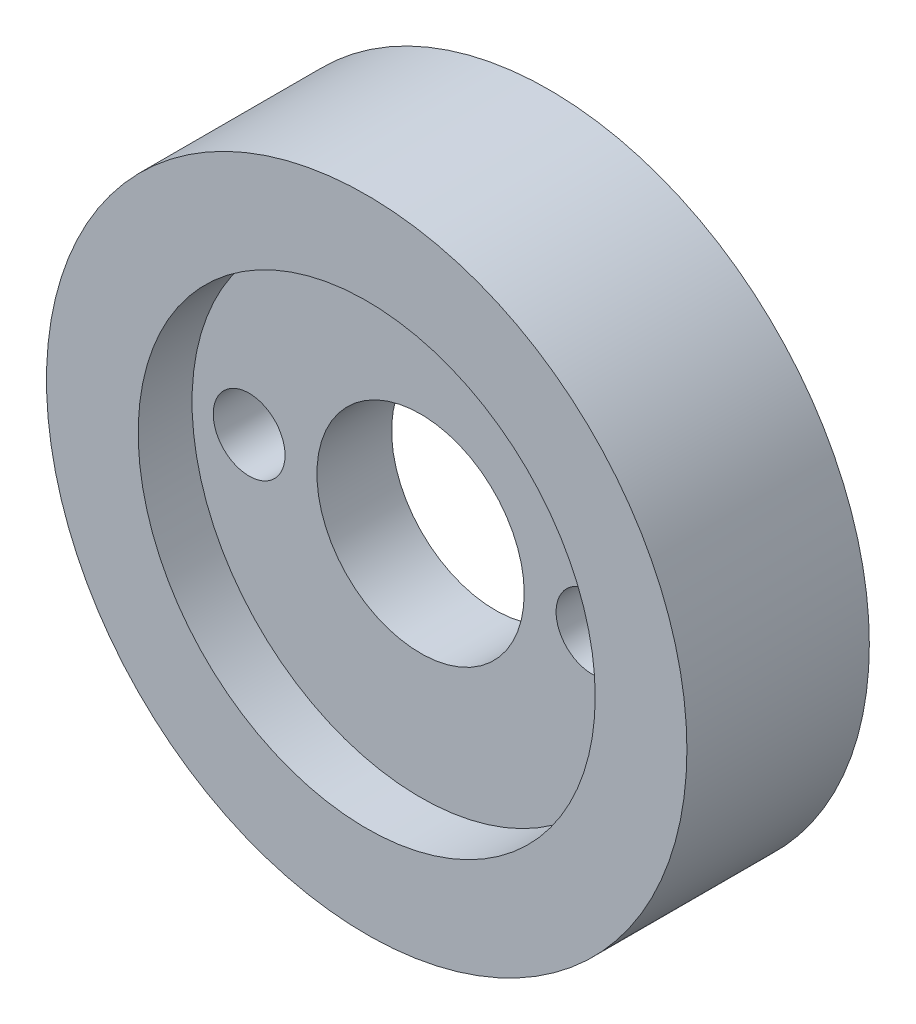
ISO-10303-21;
HEADER;
FILE_DESCRIPTION(('STEP AP214'),'2;1');
FILE_NAME('part.step','',(''),(''),'','','');
FILE_SCHEMA(('AUTOMOTIVE_DESIGN { 1 0 10303 214 1 1 1 1 }'));
ENDSEC;
DATA;
#1=APPLICATION_CONTEXT('core data for automotive mechanical design processes');
#2=APPLICATION_PROTOCOL_DEFINITION('international standard','automotive_design',2000,#1);
#3=PRODUCT_CONTEXT('',#1,'mechanical');
#4=PRODUCT('Part','Part','',(#3));
#5=PRODUCT_RELATED_PRODUCT_CATEGORY('part','',(#4));
#6=PRODUCT_DEFINITION_FORMATION('','',#4);
#7=PRODUCT_DEFINITION_CONTEXT('part definition',#1,'design');
#8=PRODUCT_DEFINITION('design','',#6,#7);
#9=PRODUCT_DEFINITION_SHAPE('','',#8);
#10=(LENGTH_UNIT() NAMED_UNIT(*) SI_UNIT(.MILLI.,.METRE.));
#11=(NAMED_UNIT(*) PLANE_ANGLE_UNIT() SI_UNIT($,.RADIAN.));
#12=(NAMED_UNIT(*) SI_UNIT($,.STERADIAN.) SOLID_ANGLE_UNIT());
#13=UNCERTAINTY_MEASURE_WITH_UNIT(LENGTH_MEASURE(1.E-05),#10,'distance_accuracy_value','');
#14=(GEOMETRIC_REPRESENTATION_CONTEXT(3) GLOBAL_UNCERTAINTY_ASSIGNED_CONTEXT((#13)) GLOBAL_UNIT_ASSIGNED_CONTEXT((#10,
#11,#12)) REPRESENTATION_CONTEXT('',''));
#15=CARTESIAN_POINT('',(0.,0.,0.));
#16=DIRECTION('',(0.,0.,1.));
#17=DIRECTION('',(1.,0.,0.));
#18=AXIS2_PLACEMENT_3D('',#15,#16,#17);
#19=CARTESIAN_POINT('',(0.,0.,2.794));
#20=DIRECTION('',(0.,0.,-1.));
#21=DIRECTION('',(-1.,0.,0.));
#22=AXIS2_PLACEMENT_3D('',#19,#20,#21);
#23=CYLINDRICAL_SURFACE('',#22,3.175);
#24=CARTESIAN_POINT('',(0.,0.,1.144));
#25=DIRECTION('',(0.,0.,1.));
#26=DIRECTION('',(1.,0.,0.));
#27=AXIS2_PLACEMENT_3D('',#24,#25,#26);
#28=CIRCLE('',#27,3.175);
#29=CARTESIAN_POINT('',(3.175,0.,1.144));
#30=VERTEX_POINT('',#29);
#31=EDGE_CURVE('E53',#30,#30,#28,.F.);
#32=ORIENTED_EDGE('',*,*,#31,.F.);
#33=EDGE_LOOP('',(#32));
#34=FACE_BOUND('',#33,.T.);
#35=CARTESIAN_POINT('',(0.,0.,-1.144));
#36=DIRECTION('',(0.,0.,1.));
#37=DIRECTION('',(1.,0.,0.));
#38=AXIS2_PLACEMENT_3D('',#35,#36,#37);
#39=CIRCLE('',#38,3.175);
#40=CARTESIAN_POINT('',(3.175,0.,-1.144));
#41=VERTEX_POINT('',#40);
#42=EDGE_CURVE('E62',#41,#41,#39,.F.);
#43=ORIENTED_EDGE('',*,*,#42,.T.);
#44=EDGE_LOOP('',(#43));
#45=FACE_BOUND('',#44,.T.);
#46=ADVANCED_FACE('F37',(#34,#45),#23,.F.);
#47=CARTESIAN_POINT('',(0.,0.,-2.794));
#48=DIRECTION('',(0.,0.,1.));
#49=DIRECTION('',(1.,0.,0.));
#50=AXIS2_PLACEMENT_3D('',#47,#48,#49);
#51=PLANE('',#50);
#52=CARTESIAN_POINT('',(0.,0.,-2.794));
#53=DIRECTION('',(0.,0.,1.));
#54=DIRECTION('',(1.,0.,0.));
#55=AXIS2_PLACEMENT_3D('',#52,#53,#54);
#56=CIRCLE('',#55,9.80909091);
#57=CARTESIAN_POINT('',(9.80909091,0.,-2.794));
#58=VERTEX_POINT('',#57);
#59=EDGE_CURVE('E41',#58,#58,#56,.T.);
#60=ORIENTED_EDGE('',*,*,#59,.F.);
#61=EDGE_LOOP('',(#60));
#62=FACE_BOUND('',#61,.T.);
#63=CARTESIAN_POINT('',(0.,0.,-2.794));
#64=DIRECTION('',(0.,0.,1.));
#65=DIRECTION('',(1.,0.,0.));
#66=AXIS2_PLACEMENT_3D('',#63,#64,#65);
#67=CIRCLE('',#66,7.);
#68=CARTESIAN_POINT('',(7.,0.,-2.794));
#69=VERTEX_POINT('',#68);
#70=EDGE_CURVE('E59',#69,#69,#67,.T.);
#71=ORIENTED_EDGE('',*,*,#70,.T.);
#72=EDGE_LOOP('',(#71));
#73=FACE_BOUND('',#72,.T.);
#74=ADVANCED_FACE('F98',(#62,#73),#51,.F.);
#75=CARTESIAN_POINT('',(0.,0.,2.794));
#76=DIRECTION('',(0.,0.,1.));
#77=DIRECTION('',(1.,0.,0.));
#78=AXIS2_PLACEMENT_3D('',#75,#76,#77);
#79=PLANE('',#78);
#80=CARTESIAN_POINT('',(0.,0.,2.794));
#81=DIRECTION('',(0.,0.,1.));
#82=DIRECTION('',(1.,0.,0.));
#83=AXIS2_PLACEMENT_3D('',#80,#81,#82);
#84=CIRCLE('',#83,9.80909091);
#85=CARTESIAN_POINT('',(9.80909091,0.,2.794));
#86=VERTEX_POINT('',#85);
#87=EDGE_CURVE('E10',#86,#86,#84,.T.);
#88=ORIENTED_EDGE('',*,*,#87,.T.);
#89=EDGE_LOOP('',(#88));
#90=FACE_BOUND('',#89,.T.);
#91=CARTESIAN_POINT('',(0.,0.,2.794));
#92=DIRECTION('',(0.,0.,1.));
#93=DIRECTION('',(1.,0.,0.));
#94=AXIS2_PLACEMENT_3D('',#91,#92,#93);
#95=CIRCLE('',#94,7.);
#96=CARTESIAN_POINT('',(7.,0.,2.794));
#97=VERTEX_POINT('',#96);
#98=EDGE_CURVE('E50',#97,#97,#95,.T.);
#99=ORIENTED_EDGE('',*,*,#98,.F.);
#100=EDGE_LOOP('',(#99));
#101=FACE_BOUND('',#100,.T.);
#102=ADVANCED_FACE('F105',(#90,#101),#79,.T.);
#103=CARTESIAN_POINT('',(0.,0.,2.794));
#104=DIRECTION('',(0.,0.,-1.));
#105=DIRECTION('',(-1.,0.,0.));
#106=AXIS2_PLACEMENT_3D('',#103,#104,#105);
#107=CYLINDRICAL_SURFACE('',#106,9.80909091);
#108=ORIENTED_EDGE('',*,*,#87,.F.);
#109=EDGE_LOOP('',(#108));
#110=FACE_BOUND('',#109,.T.);
#111=ORIENTED_EDGE('',*,*,#59,.T.);
#112=EDGE_LOOP('',(#111));
#113=FACE_BOUND('',#112,.T.);
#114=ADVANCED_FACE('F39',(#110,#113),#107,.T.);
#115=CARTESIAN_POINT('',(0.,0.,1.144));
#116=DIRECTION('',(0.,0.,1.));
#117=DIRECTION('',(1.,0.,0.));
#118=AXIS2_PLACEMENT_3D('',#115,#116,#117);
#119=CYLINDRICAL_SURFACE('',#118,7.);
#120=CARTESIAN_POINT('',(0.,0.,1.144));
#121=DIRECTION('',(0.,0.,1.));
#122=DIRECTION('',(1.,0.,0.));
#123=AXIS2_PLACEMENT_3D('',#120,#121,#122);
#124=CIRCLE('',#123,7.);
#125=CARTESIAN_POINT('',(7.,0.,1.144));
#126=VERTEX_POINT('',#125);
#127=EDGE_CURVE('E48',#126,#126,#124,.T.);
#128=ORIENTED_EDGE('',*,*,#127,.F.);
#129=EDGE_LOOP('',(#128));
#130=FACE_BOUND('',#129,.T.);
#131=ORIENTED_EDGE('',*,*,#98,.T.);
#132=EDGE_LOOP('',(#131));
#133=FACE_BOUND('',#132,.T.);
#134=ADVANCED_FACE('F111',(#130,#133),#119,.F.);
#135=CARTESIAN_POINT('',(0.,0.,1.144));
#136=DIRECTION('',(0.,0.,1.));
#137=DIRECTION('',(1.,0.,0.));
#138=AXIS2_PLACEMENT_3D('',#135,#136,#137);
#139=PLANE('',#138);
#140=ORIENTED_EDGE('',*,*,#31,.T.);
#141=EDGE_LOOP('',(#140));
#142=FACE_BOUND('',#141,.T.);
#143=CARTESIAN_POINT('',(-5.25145,0.,1.144));
#144=DIRECTION('',(0.,0.,1.));
#145=DIRECTION('',(1.,0.,0.));
#146=AXIS2_PLACEMENT_3D('',#143,#144,#145);
#147=CIRCLE('',#146,1.1);
#148=CARTESIAN_POINT('',(-4.15145,0.,1.144));
#149=VERTEX_POINT('',#148);
#150=EDGE_CURVE('E63',#149,#149,#147,.T.);
#151=ORIENTED_EDGE('',*,*,#150,.F.);
#152=EDGE_LOOP('',(#151));
#153=FACE_BOUND('',#152,.T.);
#154=ORIENTED_EDGE('',*,*,#127,.T.);
#155=EDGE_LOOP('',(#154));
#156=FACE_BOUND('',#155,.T.);
#157=CARTESIAN_POINT('',(5.25145,0.,1.144));
#158=DIRECTION('',(0.,0.,1.));
#159=DIRECTION('',(1.,0.,0.));
#160=AXIS2_PLACEMENT_3D('',#157,#158,#159);
#161=CIRCLE('',#160,1.1);
#162=CARTESIAN_POINT('',(6.35145,0.,1.144));
#163=VERTEX_POINT('',#162);
#164=EDGE_CURVE('E73',#163,#163,#161,.F.);
#165=ORIENTED_EDGE('',*,*,#164,.T.);
#166=EDGE_LOOP('',(#165));
#167=FACE_BOUND('',#166,.T.);
#168=ADVANCED_FACE('F122',(#142,#153,#156,#167),#139,.T.);
#169=CARTESIAN_POINT('',(0.,0.,-1.144));
#170=DIRECTION('',(0.,0.,-1.));
#171=DIRECTION('',(-1.,0.,0.));
#172=AXIS2_PLACEMENT_3D('',#169,#170,#171);
#173=CYLINDRICAL_SURFACE('',#172,7.);
#174=CARTESIAN_POINT('',(0.,0.,-1.144));
#175=DIRECTION('',(0.,0.,1.));
#176=DIRECTION('',(1.,0.,0.));
#177=AXIS2_PLACEMENT_3D('',#174,#175,#176);
#178=CIRCLE('',#177,7.);
#179=CARTESIAN_POINT('',(7.,0.,-1.144));
#180=VERTEX_POINT('',#179);
#181=EDGE_CURVE('E54',#180,#180,#178,.T.);
#182=ORIENTED_EDGE('',*,*,#181,.T.);
#183=EDGE_LOOP('',(#182));
#184=FACE_BOUND('',#183,.T.);
#185=ORIENTED_EDGE('',*,*,#70,.F.);
#186=EDGE_LOOP('',(#185));
#187=FACE_BOUND('',#186,.T.);
#188=ADVANCED_FACE('F93',(#184,#187),#173,.F.);
#189=CARTESIAN_POINT('',(0.,0.,-1.144));
#190=DIRECTION('',(0.,0.,-1.));
#191=DIRECTION('',(1.,0.,0.));
#192=AXIS2_PLACEMENT_3D('',#189,#190,#191);
#193=PLANE('',#192);
#194=ORIENTED_EDGE('',*,*,#42,.F.);
#195=EDGE_LOOP('',(#194));
#196=FACE_BOUND('',#195,.T.);
#197=CARTESIAN_POINT('',(-5.25145,0.,-1.144));
#198=DIRECTION('',(0.,0.,-1.));
#199=DIRECTION('',(-1.,0.,0.));
#200=AXIS2_PLACEMENT_3D('',#197,#198,#199);
#201=CIRCLE('',#200,1.1);
#202=CARTESIAN_POINT('',(-6.35145,0.,-1.144));
#203=VERTEX_POINT('',#202);
#204=EDGE_CURVE('E70',#203,#203,#201,.T.);
#205=ORIENTED_EDGE('',*,*,#204,.F.);
#206=EDGE_LOOP('',(#205));
#207=FACE_BOUND('',#206,.T.);
#208=ORIENTED_EDGE('',*,*,#181,.F.);
#209=EDGE_LOOP('',(#208));
#210=FACE_BOUND('',#209,.T.);
#211=CARTESIAN_POINT('',(5.25145,0.,-1.144));
#212=DIRECTION('',(0.,0.,-1.));
#213=DIRECTION('',(-1.,0.,0.));
#214=AXIS2_PLACEMENT_3D('',#211,#212,#213);
#215=CIRCLE('',#214,1.1);
#216=CARTESIAN_POINT('',(4.15145,0.,-1.144));
#217=VERTEX_POINT('',#216);
#218=EDGE_CURVE('E76',#217,#217,#215,.F.);
#219=ORIENTED_EDGE('',*,*,#218,.T.);
#220=EDGE_LOOP('',(#219));
#221=FACE_BOUND('',#220,.T.);
#222=ADVANCED_FACE('F80',(#196,#207,#210,#221),#193,.T.);
#223=CARTESIAN_POINT('',(5.25145,0.,-2.794));
#224=DIRECTION('',(0.,0.,1.));
#225=DIRECTION('',(1.,0.,0.));
#226=AXIS2_PLACEMENT_3D('',#223,#224,#225);
#227=CYLINDRICAL_SURFACE('',#226,1.1);
#228=ORIENTED_EDGE('',*,*,#164,.F.);
#229=EDGE_LOOP('',(#228));
#230=FACE_BOUND('',#229,.T.);
#231=ORIENTED_EDGE('',*,*,#218,.F.);
#232=EDGE_LOOP('',(#231));
#233=FACE_BOUND('',#232,.T.);
#234=ADVANCED_FACE('F82',(#230,#233),#227,.F.);
#235=CARTESIAN_POINT('',(-5.25145,0.,-2.794));
#236=DIRECTION('',(0.,0.,1.));
#237=DIRECTION('',(1.,0.,0.));
#238=AXIS2_PLACEMENT_3D('',#235,#236,#237);
#239=CYLINDRICAL_SURFACE('',#238,1.1);
#240=ORIENTED_EDGE('',*,*,#150,.T.);
#241=EDGE_LOOP('',(#240));
#242=FACE_BOUND('',#241,.T.);
#243=ORIENTED_EDGE('',*,*,#204,.T.);
#244=EDGE_LOOP('',(#243));
#245=FACE_BOUND('',#244,.T.);
#246=ADVANCED_FACE('F84',(#242,#245),#239,.F.);
#247=CLOSED_SHELL('',(#46,#74,#102,#114,#134,#168,#188,#222,#234,#246));
#248=MANIFOLD_SOLID_BREP('B2',#247);
#249=ADVANCED_BREP_SHAPE_REPRESENTATION('',(#18,#248),#14);
#250=SHAPE_DEFINITION_REPRESENTATION(#9,#249);
ENDSEC;
END-ISO-10303-21;
